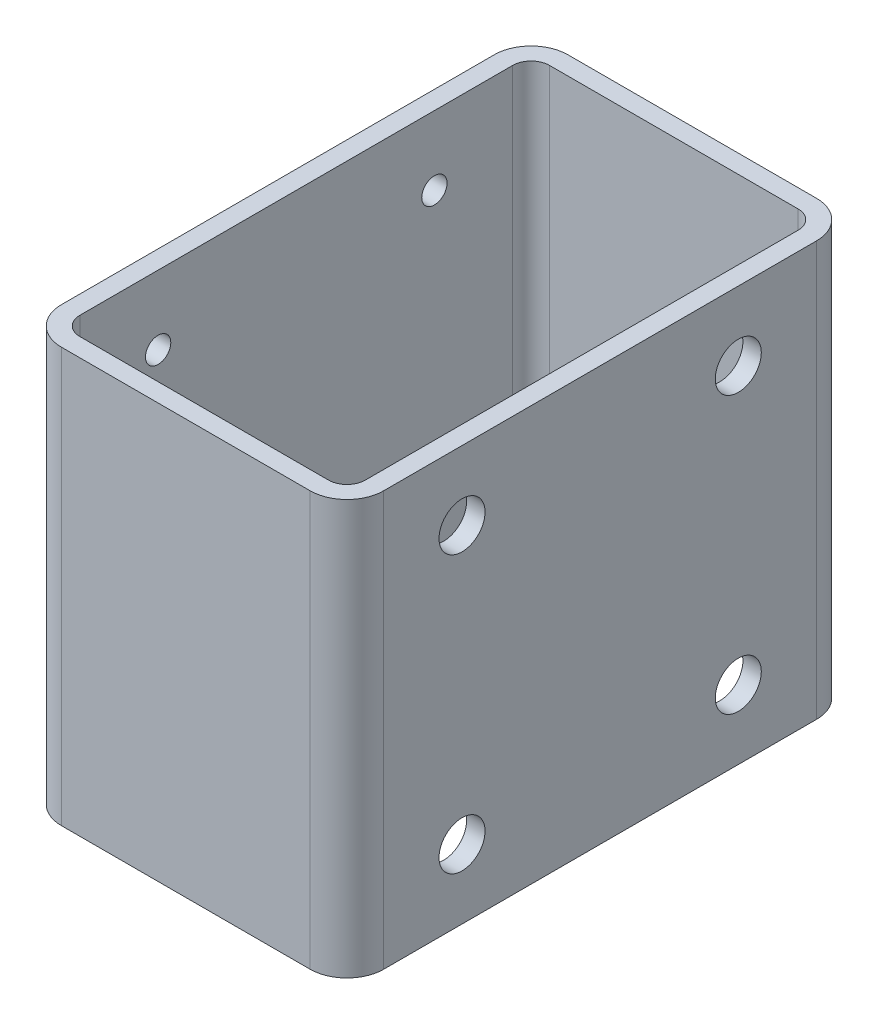
ISO-10303-21;
HEADER;
FILE_DESCRIPTION(('STEP AP214'),'2;1');
FILE_NAME('part.step','',(''),(''),'','','');
FILE_SCHEMA(('AUTOMOTIVE_DESIGN { 1 0 10303 214 1 1 1 1 }'));
ENDSEC;
DATA;
#1=APPLICATION_CONTEXT('core data for automotive mechanical design processes');
#2=APPLICATION_PROTOCOL_DEFINITION('international standard','automotive_design',2000,#1);
#3=PRODUCT_CONTEXT('',#1,'mechanical');
#4=PRODUCT('Part','Part','',(#3));
#5=PRODUCT_RELATED_PRODUCT_CATEGORY('part','',(#4));
#6=PRODUCT_DEFINITION_FORMATION('','',#4);
#7=PRODUCT_DEFINITION_CONTEXT('part definition',#1,'design');
#8=PRODUCT_DEFINITION('design','',#6,#7);
#9=PRODUCT_DEFINITION_SHAPE('','',#8);
#10=(LENGTH_UNIT() NAMED_UNIT(*) SI_UNIT(.MILLI.,.METRE.));
#11=(NAMED_UNIT(*) PLANE_ANGLE_UNIT() SI_UNIT($,.RADIAN.));
#12=(NAMED_UNIT(*) SI_UNIT($,.STERADIAN.) SOLID_ANGLE_UNIT());
#13=UNCERTAINTY_MEASURE_WITH_UNIT(LENGTH_MEASURE(1.E-05),#10,'distance_accuracy_value','');
#14=(GEOMETRIC_REPRESENTATION_CONTEXT(3) GLOBAL_UNCERTAINTY_ASSIGNED_CONTEXT((#13)) GLOBAL_UNIT_ASSIGNED_CONTEXT((#10,
#11,#12)) REPRESENTATION_CONTEXT('',''));
#15=CARTESIAN_POINT('',(0.,0.,0.));
#16=DIRECTION('',(0.,0.,1.));
#17=DIRECTION('',(1.,0.,0.));
#18=AXIS2_PLACEMENT_3D('',#15,#16,#17);
#19=CARTESIAN_POINT('',(-54.,180.,94.));
#20=DIRECTION('',(0.,-1.,0.));
#21=DIRECTION('',(0.,0.,-1.));
#22=AXIS2_PLACEMENT_3D('',#19,#20,#21);
#23=CYLINDRICAL_SURFACE('',#22,16.);
#24=CARTESIAN_POINT('',(-54.,0.,94.));
#25=DIRECTION('',(0.,1.,0.));
#26=DIRECTION('',(0.,0.,1.));
#27=AXIS2_PLACEMENT_3D('',#24,#25,#26);
#28=CIRCLE('',#27,16.);
#29=CARTESIAN_POINT('',(-70.0000000000001,0.,94.));
#30=VERTEX_POINT('',#29);
#31=CARTESIAN_POINT('',(-54.,0.,110.));
#32=VERTEX_POINT('',#31);
#33=EDGE_CURVE('E238',#30,#32,#28,.T.);
#34=ORIENTED_EDGE('',*,*,#33,.T.);
#35=DIRECTION('',(0.,-1.,0.));
#36=VECTOR('',#35,1.);
#37=CARTESIAN_POINT('',(-54.,180.,110.));
#38=LINE('',#37,#36);
#39=CARTESIAN_POINT('',(-54.,180.,110.));
#40=VERTEX_POINT('',#39);
#41=EDGE_CURVE('E12',#40,#32,#38,.T.);
#42=ORIENTED_EDGE('',*,*,#41,.F.);
#43=CARTESIAN_POINT('',(-54.,180.,94.));
#44=DIRECTION('',(0.,1.,0.));
#45=DIRECTION('',(0.,0.,1.));
#46=AXIS2_PLACEMENT_3D('',#43,#44,#45);
#47=CIRCLE('',#46,16.);
#48=CARTESIAN_POINT('',(-70.0000000000001,180.,94.));
#49=VERTEX_POINT('',#48);
#50=EDGE_CURVE('E342',#49,#40,#47,.T.);
#51=ORIENTED_EDGE('',*,*,#50,.F.);
#52=DIRECTION('',(0.,-1.,0.));
#53=VECTOR('',#52,1.);
#54=CARTESIAN_POINT('',(-70.0000000000001,180.,94.));
#55=LINE('',#54,#53);
#56=EDGE_CURVE('E253',#49,#30,#55,.T.);
#57=ORIENTED_EDGE('',*,*,#56,.T.);
#58=EDGE_LOOP('',(#34,#42,#51,#57));
#59=FACE_BOUND('',#58,.T.);
#60=ADVANCED_FACE('F64',(#59),#23,.T.);
#61=CARTESIAN_POINT('',(-54.,180.,110.));
#62=DIRECTION('',(0.,0.,-1.));
#63=DIRECTION('',(-1.,0.,0.));
#64=AXIS2_PLACEMENT_3D('',#61,#62,#63);
#65=PLANE('',#64);
#66=DIRECTION('',(1.,0.,0.));
#67=VECTOR('',#66,1.);
#68=CARTESIAN_POINT('',(-54.,0.,110.));
#69=LINE('',#68,#67);
#70=CARTESIAN_POINT('',(54.0000000000001,0.,110.));
#71=VERTEX_POINT('',#70);
#72=EDGE_CURVE('E241',#32,#71,#69,.T.);
#73=ORIENTED_EDGE('',*,*,#72,.T.);
#74=DIRECTION('',(0.,-1.,0.));
#75=VECTOR('',#74,1.);
#76=CARTESIAN_POINT('',(54.0000000000001,180.,110.));
#77=LINE('',#76,#75);
#78=CARTESIAN_POINT('',(54.0000000000001,180.,110.));
#79=VERTEX_POINT('',#78);
#80=EDGE_CURVE('E74',#79,#71,#77,.T.);
#81=ORIENTED_EDGE('',*,*,#80,.F.);
#82=DIRECTION('',(1.,0.,0.));
#83=VECTOR('',#82,1.);
#84=CARTESIAN_POINT('',(-54.,180.,110.));
#85=LINE('',#84,#83);
#86=EDGE_CURVE('E344',#40,#79,#85,.T.);
#87=ORIENTED_EDGE('',*,*,#86,.F.);
#88=ORIENTED_EDGE('',*,*,#41,.T.);
#89=EDGE_LOOP('',(#73,#81,#87,#88));
#90=FACE_BOUND('',#89,.T.);
#91=ADVANCED_FACE('F385',(#90),#65,.F.);
#92=CARTESIAN_POINT('',(54.0000000000001,180.,94.));
#93=DIRECTION('',(0.,-1.,0.));
#94=DIRECTION('',(0.,0.,-1.));
#95=AXIS2_PLACEMENT_3D('',#92,#93,#94);
#96=CYLINDRICAL_SURFACE('',#95,16.);
#97=CARTESIAN_POINT('',(54.0000000000001,0.,94.));
#98=DIRECTION('',(0.,1.,0.));
#99=DIRECTION('',(0.,0.,1.));
#100=AXIS2_PLACEMENT_3D('',#97,#98,#99);
#101=CIRCLE('',#100,16.);
#102=CARTESIAN_POINT('',(70.0000000000001,0.,94.));
#103=VERTEX_POINT('',#102);
#104=EDGE_CURVE('E243',#71,#103,#101,.T.);
#105=ORIENTED_EDGE('',*,*,#104,.T.);
#106=DIRECTION('',(0.,-1.,0.));
#107=VECTOR('',#106,1.);
#108=CARTESIAN_POINT('',(70.0000000000001,180.,94.));
#109=LINE('',#108,#107);
#110=CARTESIAN_POINT('',(70.0000000000001,180.,94.));
#111=VERTEX_POINT('',#110);
#112=EDGE_CURVE('E260',#111,#103,#109,.T.);
#113=ORIENTED_EDGE('',*,*,#112,.F.);
#114=CARTESIAN_POINT('',(54.0000000000001,180.,94.));
#115=DIRECTION('',(0.,1.,0.));
#116=DIRECTION('',(0.,0.,1.));
#117=AXIS2_PLACEMENT_3D('',#114,#115,#116);
#118=CIRCLE('',#117,16.);
#119=EDGE_CURVE('E346',#79,#111,#118,.T.);
#120=ORIENTED_EDGE('',*,*,#119,.F.);
#121=ORIENTED_EDGE('',*,*,#80,.T.);
#122=EDGE_LOOP('',(#105,#113,#120,#121));
#123=FACE_BOUND('',#122,.T.);
#124=ADVANCED_FACE('F390',(#123),#96,.T.);
#125=CARTESIAN_POINT('',(70.,180.,-94.));
#126=DIRECTION('',(-1.,0.,0.));
#127=DIRECTION('',(0.,0.,1.));
#128=AXIS2_PLACEMENT_3D('',#125,#126,#127);
#129=PLANE('',#128);
#130=CARTESIAN_POINT('',(70.,150.,-60.));
#131=DIRECTION('',(1.,0.,0.));
#132=DIRECTION('',(0.,0.,-1.));
#133=AXIS2_PLACEMENT_3D('',#130,#131,#132);
#134=CIRCLE('',#133,10.);
#135=CARTESIAN_POINT('',(70.,150.,-70.));
#136=VERTEX_POINT('',#135);
#137=EDGE_CURVE('E480',#136,#136,#134,.T.);
#138=ORIENTED_EDGE('',*,*,#137,.F.);
#139=EDGE_LOOP('',(#138));
#140=FACE_BOUND('',#139,.T.);
#141=CARTESIAN_POINT('',(70.0000000000001,30.,60.));
#142=DIRECTION('',(1.,0.,0.));
#143=DIRECTION('',(0.,0.,-1.));
#144=AXIS2_PLACEMENT_3D('',#141,#142,#143);
#145=CIRCLE('',#144,10.);
#146=CARTESIAN_POINT('',(70.0000000000001,30.,50.));
#147=VERTEX_POINT('',#146);
#148=EDGE_CURVE('E477',#147,#147,#145,.T.);
#149=ORIENTED_EDGE('',*,*,#148,.F.);
#150=EDGE_LOOP('',(#149));
#151=FACE_BOUND('',#150,.T.);
#152=CARTESIAN_POINT('',(70.,30.,-60.));
#153=DIRECTION('',(1.,0.,0.));
#154=DIRECTION('',(0.,0.,-1.));
#155=AXIS2_PLACEMENT_3D('',#152,#153,#154);
#156=CIRCLE('',#155,10.);
#157=CARTESIAN_POINT('',(70.,30.,-70.));
#158=VERTEX_POINT('',#157);
#159=EDGE_CURVE('E475',#158,#158,#156,.T.);
#160=ORIENTED_EDGE('',*,*,#159,.F.);
#161=EDGE_LOOP('',(#160));
#162=FACE_BOUND('',#161,.T.);
#163=CARTESIAN_POINT('',(70.0000000000001,150.,60.));
#164=DIRECTION('',(1.,0.,0.));
#165=DIRECTION('',(0.,0.,-1.));
#166=AXIS2_PLACEMENT_3D('',#163,#164,#165);
#167=CIRCLE('',#166,10.);
#168=CARTESIAN_POINT('',(70.0000000000001,150.,50.));
#169=VERTEX_POINT('',#168);
#170=EDGE_CURVE('E283',#169,#169,#167,.T.);
#171=ORIENTED_EDGE('',*,*,#170,.F.);
#172=EDGE_LOOP('',(#171));
#173=FACE_BOUND('',#172,.T.);
#174=DIRECTION('',(0.,0.,-1.));
#175=VECTOR('',#174,1.);
#176=CARTESIAN_POINT('',(70.,0.,-94.));
#177=LINE('',#176,#175);
#178=CARTESIAN_POINT('',(70.,0.,-94.));
#179=VERTEX_POINT('',#178);
#180=EDGE_CURVE('E245',#103,#179,#177,.T.);
#181=ORIENTED_EDGE('',*,*,#180,.T.);
#182=DIRECTION('',(0.,-1.,0.));
#183=VECTOR('',#182,1.);
#184=CARTESIAN_POINT('',(70.,180.,-94.));
#185=LINE('',#184,#183);
#186=CARTESIAN_POINT('',(70.,180.,-94.));
#187=VERTEX_POINT('',#186);
#188=EDGE_CURVE('E257',#187,#179,#185,.T.);
#189=ORIENTED_EDGE('',*,*,#188,.F.);
#190=DIRECTION('',(0.,0.,-1.));
#191=VECTOR('',#190,1.);
#192=CARTESIAN_POINT('',(70.,180.,-94.));
#193=LINE('',#192,#191);
#194=EDGE_CURVE('E348',#111,#187,#193,.T.);
#195=ORIENTED_EDGE('',*,*,#194,.F.);
#196=ORIENTED_EDGE('',*,*,#112,.T.);
#197=EDGE_LOOP('',(#181,#189,#195,#196));
#198=FACE_BOUND('',#197,.T.);
#199=ADVANCED_FACE('F354',(#140,#151,#162,#173,#198),#129,.F.);
#200=CARTESIAN_POINT('',(54.,180.,-94.));
#201=DIRECTION('',(0.,-1.,0.));
#202=DIRECTION('',(0.,0.,-1.));
#203=AXIS2_PLACEMENT_3D('',#200,#201,#202);
#204=CYLINDRICAL_SURFACE('',#203,16.);
#205=CARTESIAN_POINT('',(54.,0.,-94.));
#206=DIRECTION('',(0.,1.,0.));
#207=DIRECTION('',(0.,0.,1.));
#208=AXIS2_PLACEMENT_3D('',#205,#206,#207);
#209=CIRCLE('',#208,16.);
#210=CARTESIAN_POINT('',(54.0000000000001,0.,-110.));
#211=VERTEX_POINT('',#210);
#212=EDGE_CURVE('E247',#179,#211,#209,.T.);
#213=ORIENTED_EDGE('',*,*,#212,.T.);
#214=DIRECTION('',(0.,-1.,0.));
#215=VECTOR('',#214,1.);
#216=CARTESIAN_POINT('',(54.0000000000001,180.,-110.));
#217=LINE('',#216,#215);
#218=CARTESIAN_POINT('',(54.0000000000001,180.,-110.));
#219=VERTEX_POINT('',#218);
#220=EDGE_CURVE('E204',#219,#211,#217,.T.);
#221=ORIENTED_EDGE('',*,*,#220,.F.);
#222=CARTESIAN_POINT('',(54.,180.,-94.));
#223=DIRECTION('',(0.,1.,0.));
#224=DIRECTION('',(0.,0.,1.));
#225=AXIS2_PLACEMENT_3D('',#222,#223,#224);
#226=CIRCLE('',#225,16.);
#227=EDGE_CURVE('E195',#187,#219,#226,.T.);
#228=ORIENTED_EDGE('',*,*,#227,.F.);
#229=ORIENTED_EDGE('',*,*,#188,.T.);
#230=EDGE_LOOP('',(#213,#221,#228,#229));
#231=FACE_BOUND('',#230,.T.);
#232=ADVANCED_FACE('F358',(#231),#204,.T.);
#233=CARTESIAN_POINT('',(54.0000000000001,180.,-110.));
#234=DIRECTION('',(0.,0.,1.));
#235=DIRECTION('',(1.,0.,0.));
#236=AXIS2_PLACEMENT_3D('',#233,#234,#235);
#237=PLANE('',#236);
#238=DIRECTION('',(-1.,0.,0.));
#239=VECTOR('',#238,1.);
#240=CARTESIAN_POINT('',(54.0000000000001,0.,-110.));
#241=LINE('',#240,#239);
#242=CARTESIAN_POINT('',(-54.,0.,-110.));
#243=VERTEX_POINT('',#242);
#244=EDGE_CURVE('E203',#211,#243,#241,.T.);
#245=ORIENTED_EDGE('',*,*,#244,.T.);
#246=DIRECTION('',(0.,-1.,0.));
#247=VECTOR('',#246,1.);
#248=CARTESIAN_POINT('',(-54.,180.,-110.));
#249=LINE('',#248,#247);
#250=CARTESIAN_POINT('',(-54.,180.,-110.));
#251=VERTEX_POINT('',#250);
#252=EDGE_CURVE('E200',#251,#243,#249,.T.);
#253=ORIENTED_EDGE('',*,*,#252,.F.);
#254=DIRECTION('',(-1.,0.,0.));
#255=VECTOR('',#254,1.);
#256=CARTESIAN_POINT('',(54.0000000000001,180.,-110.));
#257=LINE('',#256,#255);
#258=EDGE_CURVE('E189',#219,#251,#257,.T.);
#259=ORIENTED_EDGE('',*,*,#258,.F.);
#260=ORIENTED_EDGE('',*,*,#220,.T.);
#261=EDGE_LOOP('',(#245,#253,#259,#260));
#262=FACE_BOUND('',#261,.T.);
#263=ADVANCED_FACE('F201',(#262),#237,.F.);
#264=CARTESIAN_POINT('',(-54.,180.,-94.));
#265=DIRECTION('',(0.,-1.,0.));
#266=DIRECTION('',(0.,0.,-1.));
#267=AXIS2_PLACEMENT_3D('',#264,#265,#266);
#268=CYLINDRICAL_SURFACE('',#267,16.);
#269=CARTESIAN_POINT('',(-54.,0.,-94.));
#270=DIRECTION('',(0.,1.,0.));
#271=DIRECTION('',(0.,0.,1.));
#272=AXIS2_PLACEMENT_3D('',#269,#270,#271);
#273=CIRCLE('',#272,16.);
#274=CARTESIAN_POINT('',(-70.0000000000001,0.,-94.));
#275=VERTEX_POINT('',#274);
#276=EDGE_CURVE('E136',#243,#275,#273,.T.);
#277=ORIENTED_EDGE('',*,*,#276,.T.);
#278=DIRECTION('',(0.,-1.,0.));
#279=VECTOR('',#278,1.);
#280=CARTESIAN_POINT('',(-70.0000000000001,180.,-94.));
#281=LINE('',#280,#279);
#282=CARTESIAN_POINT('',(-70.0000000000001,180.,-94.));
#283=VERTEX_POINT('',#282);
#284=EDGE_CURVE('E205',#283,#275,#281,.T.);
#285=ORIENTED_EDGE('',*,*,#284,.F.);
#286=CARTESIAN_POINT('',(-54.,180.,-94.));
#287=DIRECTION('',(0.,1.,0.));
#288=DIRECTION('',(0.,0.,1.));
#289=AXIS2_PLACEMENT_3D('',#286,#287,#288);
#290=CIRCLE('',#289,16.);
#291=EDGE_CURVE('E193',#251,#283,#290,.T.);
#292=ORIENTED_EDGE('',*,*,#291,.F.);
#293=ORIENTED_EDGE('',*,*,#252,.T.);
#294=EDGE_LOOP('',(#277,#285,#292,#293));
#295=FACE_BOUND('',#294,.T.);
#296=ADVANCED_FACE('F207',(#295),#268,.T.);
#297=CARTESIAN_POINT('',(54.0000000000001,180.,94.));
#298=DIRECTION('',(0.,-1.,0.));
#299=DIRECTION('',(0.,0.,-1.));
#300=AXIS2_PLACEMENT_3D('',#297,#298,#299);
#301=CYLINDRICAL_SURFACE('',#300,8.00000000000003);
#302=CARTESIAN_POINT('',(54.0000000000001,0.,94.));
#303=DIRECTION('',(0.,1.,0.));
#304=DIRECTION('',(0.,0.,1.));
#305=AXIS2_PLACEMENT_3D('',#302,#303,#304);
#306=CIRCLE('',#305,8.00000000000003);
#307=CARTESIAN_POINT('',(54.,0.,102.));
#308=VERTEX_POINT('',#307);
#309=CARTESIAN_POINT('',(62.0000000000001,0.,94.));
#310=VERTEX_POINT('',#309);
#311=EDGE_CURVE('E213',#308,#310,#306,.T.);
#312=ORIENTED_EDGE('',*,*,#311,.F.);
#313=DIRECTION('',(0.,-1.,0.));
#314=VECTOR('',#313,1.);
#315=CARTESIAN_POINT('',(54.,180.,102.));
#316=LINE('',#315,#314);
#317=CARTESIAN_POINT('',(54.,180.,102.));
#318=VERTEX_POINT('',#317);
#319=EDGE_CURVE('E150',#318,#308,#316,.T.);
#320=ORIENTED_EDGE('',*,*,#319,.F.);
#321=CARTESIAN_POINT('',(54.0000000000001,180.,94.));
#322=DIRECTION('',(0.,1.,0.));
#323=DIRECTION('',(0.,0.,1.));
#324=AXIS2_PLACEMENT_3D('',#321,#322,#323);
#325=CIRCLE('',#324,8.00000000000003);
#326=CARTESIAN_POINT('',(62.0000000000001,180.,94.));
#327=VERTEX_POINT('',#326);
#328=EDGE_CURVE('E252',#318,#327,#325,.T.);
#329=ORIENTED_EDGE('',*,*,#328,.T.);
#330=DIRECTION('',(0.,-1.,0.));
#331=VECTOR('',#330,1.);
#332=CARTESIAN_POINT('',(62.0000000000001,180.,94.));
#333=LINE('',#332,#331);
#334=EDGE_CURVE('E209',#327,#310,#333,.T.);
#335=ORIENTED_EDGE('',*,*,#334,.T.);
#336=EDGE_LOOP('',(#312,#320,#329,#335));
#337=FACE_BOUND('',#336,.T.);
#338=ADVANCED_FACE('F66',(#337),#301,.F.);
#339=CARTESIAN_POINT('',(-54.,180.,102.));
#340=DIRECTION('',(0.,0.,-1.));
#341=DIRECTION('',(-1.,0.,0.));
#342=AXIS2_PLACEMENT_3D('',#339,#340,#341);
#343=PLANE('',#342);
#344=DIRECTION('',(1.,0.,0.));
#345=VECTOR('',#344,1.);
#346=CARTESIAN_POINT('',(-54.,0.,102.));
#347=LINE('',#346,#345);
#348=CARTESIAN_POINT('',(-54.,0.,102.));
#349=VERTEX_POINT('',#348);
#350=EDGE_CURVE('E216',#349,#308,#347,.T.);
#351=ORIENTED_EDGE('',*,*,#350,.F.);
#352=DIRECTION('',(0.,-1.,0.));
#353=VECTOR('',#352,1.);
#354=CARTESIAN_POINT('',(-54.,180.,102.));
#355=LINE('',#354,#353);
#356=CARTESIAN_POINT('',(-54.,180.,102.));
#357=VERTEX_POINT('',#356);
#358=EDGE_CURVE('E276',#357,#349,#355,.T.);
#359=ORIENTED_EDGE('',*,*,#358,.F.);
#360=DIRECTION('',(1.,0.,0.));
#361=VECTOR('',#360,1.);
#362=CARTESIAN_POINT('',(-54.,180.,102.));
#363=LINE('',#362,#361);
#364=EDGE_CURVE('E321',#357,#318,#363,.T.);
#365=ORIENTED_EDGE('',*,*,#364,.T.);
#366=ORIENTED_EDGE('',*,*,#319,.T.);
#367=EDGE_LOOP('',(#351,#359,#365,#366));
#368=FACE_BOUND('',#367,.T.);
#369=ADVANCED_FACE('F412',(#368),#343,.T.);
#370=CARTESIAN_POINT('',(-54.,180.,94.));
#371=DIRECTION('',(0.,-1.,0.));
#372=DIRECTION('',(0.,0.,-1.));
#373=AXIS2_PLACEMENT_3D('',#370,#371,#372);
#374=CYLINDRICAL_SURFACE('',#373,8.00000000000002);
#375=CARTESIAN_POINT('',(-54.,0.,94.));
#376=DIRECTION('',(0.,1.,0.));
#377=DIRECTION('',(0.,0.,1.));
#378=AXIS2_PLACEMENT_3D('',#375,#376,#377);
#379=CIRCLE('',#378,8.00000000000002);
#380=CARTESIAN_POINT('',(-62.0000000000001,0.,94.));
#381=VERTEX_POINT('',#380);
#382=EDGE_CURVE('E220',#381,#349,#379,.T.);
#383=ORIENTED_EDGE('',*,*,#382,.F.);
#384=DIRECTION('',(0.,-1.,0.));
#385=VECTOR('',#384,1.);
#386=CARTESIAN_POINT('',(-62.0000000000001,180.,94.));
#387=LINE('',#386,#385);
#388=CARTESIAN_POINT('',(-62.0000000000001,180.,94.));
#389=VERTEX_POINT('',#388);
#390=EDGE_CURVE('E274',#389,#381,#387,.T.);
#391=ORIENTED_EDGE('',*,*,#390,.F.);
#392=CARTESIAN_POINT('',(-54.,180.,94.));
#393=DIRECTION('',(0.,1.,0.));
#394=DIRECTION('',(0.,0.,1.));
#395=AXIS2_PLACEMENT_3D('',#392,#393,#394);
#396=CIRCLE('',#395,8.00000000000002);
#397=EDGE_CURVE('E324',#389,#357,#396,.T.);
#398=ORIENTED_EDGE('',*,*,#397,.T.);
#399=ORIENTED_EDGE('',*,*,#358,.T.);
#400=EDGE_LOOP('',(#383,#391,#398,#399));
#401=FACE_BOUND('',#400,.T.);
#402=ADVANCED_FACE('F409',(#401),#374,.F.);
#403=CARTESIAN_POINT('',(-62.0000000000001,180.,94.));
#404=DIRECTION('',(1.,0.,0.));
#405=DIRECTION('',(0.,0.,-1.));
#406=AXIS2_PLACEMENT_3D('',#403,#404,#405);
#407=PLANE('',#406);
#408=CARTESIAN_POINT('',(-62.0000000000001,30.,60.));
#409=DIRECTION('',(1.,0.,0.));
#410=DIRECTION('',(0.,0.,-1.));
#411=AXIS2_PLACEMENT_3D('',#408,#409,#410);
#412=CIRCLE('',#411,5.5);
#413=CARTESIAN_POINT('',(-62.0000000000001,30.,54.5));
#414=VERTEX_POINT('',#413);
#415=EDGE_CURVE('E217',#414,#414,#412,.T.);
#416=ORIENTED_EDGE('',*,*,#415,.F.);
#417=EDGE_LOOP('',(#416));
#418=FACE_BOUND('',#417,.T.);
#419=CARTESIAN_POINT('',(-62.0000000000001,150.,-60.));
#420=DIRECTION('',(1.,0.,0.));
#421=DIRECTION('',(0.,0.,-1.));
#422=AXIS2_PLACEMENT_3D('',#419,#420,#421);
#423=CIRCLE('',#422,5.5);
#424=CARTESIAN_POINT('',(-62.0000000000001,150.,-65.5));
#425=VERTEX_POINT('',#424);
#426=EDGE_CURVE('E315',#425,#425,#423,.T.);
#427=ORIENTED_EDGE('',*,*,#426,.F.);
#428=EDGE_LOOP('',(#427));
#429=FACE_BOUND('',#428,.T.);
#430=CARTESIAN_POINT('',(-62.0000000000001,150.,60.));
#431=DIRECTION('',(1.,0.,0.));
#432=DIRECTION('',(0.,0.,-1.));
#433=AXIS2_PLACEMENT_3D('',#430,#431,#432);
#434=CIRCLE('',#433,5.5);
#435=CARTESIAN_POINT('',(-62.0000000000001,150.,54.5));
#436=VERTEX_POINT('',#435);
#437=EDGE_CURVE('E312',#436,#436,#434,.T.);
#438=ORIENTED_EDGE('',*,*,#437,.F.);
#439=EDGE_LOOP('',(#438));
#440=FACE_BOUND('',#439,.T.);
#441=CARTESIAN_POINT('',(-62.0000000000001,30.,-60.));
#442=DIRECTION('',(1.,0.,0.));
#443=DIRECTION('',(0.,0.,-1.));
#444=AXIS2_PLACEMENT_3D('',#441,#442,#443);
#445=CIRCLE('',#444,5.5);
#446=CARTESIAN_POINT('',(-62.0000000000001,30.,-65.5));
#447=VERTEX_POINT('',#446);
#448=EDGE_CURVE('E309',#447,#447,#445,.T.);
#449=ORIENTED_EDGE('',*,*,#448,.F.);
#450=EDGE_LOOP('',(#449));
#451=FACE_BOUND('',#450,.T.);
#452=DIRECTION('',(0.,0.,1.));
#453=VECTOR('',#452,1.);
#454=CARTESIAN_POINT('',(-62.0000000000001,0.,94.));
#455=LINE('',#454,#453);
#456=CARTESIAN_POINT('',(-62.0000000000001,0.,-94.));
#457=VERTEX_POINT('',#456);
#458=EDGE_CURVE('E223',#457,#381,#455,.T.);
#459=ORIENTED_EDGE('',*,*,#458,.F.);
#460=DIRECTION('',(0.,-1.,0.));
#461=VECTOR('',#460,1.);
#462=CARTESIAN_POINT('',(-62.0000000000001,180.,-94.));
#463=LINE('',#462,#461);
#464=CARTESIAN_POINT('',(-62.0000000000001,180.,-94.));
#465=VERTEX_POINT('',#464);
#466=EDGE_CURVE('E272',#465,#457,#463,.T.);
#467=ORIENTED_EDGE('',*,*,#466,.F.);
#468=DIRECTION('',(0.,0.,1.));
#469=VECTOR('',#468,1.);
#470=CARTESIAN_POINT('',(-62.0000000000001,180.,94.));
#471=LINE('',#470,#469);
#472=EDGE_CURVE('E327',#465,#389,#471,.T.);
#473=ORIENTED_EDGE('',*,*,#472,.T.);
#474=ORIENTED_EDGE('',*,*,#390,.T.);
#475=EDGE_LOOP('',(#459,#467,#473,#474));
#476=FACE_BOUND('',#475,.T.);
#477=ADVANCED_FACE('F405',(#418,#429,#440,#451,#476),#407,.T.);
#478=CARTESIAN_POINT('',(-54.,180.,-94.));
#479=DIRECTION('',(0.,-1.,0.));
#480=DIRECTION('',(0.,0.,-1.));
#481=AXIS2_PLACEMENT_3D('',#478,#479,#480);
#482=CYLINDRICAL_SURFACE('',#481,8.00000000000002);
#483=CARTESIAN_POINT('',(-54.,0.,-94.));
#484=DIRECTION('',(0.,1.,0.));
#485=DIRECTION('',(0.,0.,1.));
#486=AXIS2_PLACEMENT_3D('',#483,#484,#485);
#487=CIRCLE('',#486,8.00000000000002);
#488=CARTESIAN_POINT('',(-54.,0.,-102.));
#489=VERTEX_POINT('',#488);
#490=EDGE_CURVE('E226',#489,#457,#487,.T.);
#491=ORIENTED_EDGE('',*,*,#490,.F.);
#492=DIRECTION('',(0.,-1.,0.));
#493=VECTOR('',#492,1.);
#494=CARTESIAN_POINT('',(-54.,180.,-102.));
#495=LINE('',#494,#493);
#496=CARTESIAN_POINT('',(-54.,180.,-102.));
#497=VERTEX_POINT('',#496);
#498=EDGE_CURVE('E270',#497,#489,#495,.T.);
#499=ORIENTED_EDGE('',*,*,#498,.F.);
#500=CARTESIAN_POINT('',(-54.,180.,-94.));
#501=DIRECTION('',(0.,1.,0.));
#502=DIRECTION('',(0.,0.,1.));
#503=AXIS2_PLACEMENT_3D('',#500,#501,#502);
#504=CIRCLE('',#503,8.00000000000002);
#505=EDGE_CURVE('E330',#497,#465,#504,.T.);
#506=ORIENTED_EDGE('',*,*,#505,.T.);
#507=ORIENTED_EDGE('',*,*,#466,.T.);
#508=EDGE_LOOP('',(#491,#499,#506,#507));
#509=FACE_BOUND('',#508,.T.);
#510=ADVANCED_FACE('F401',(#509),#482,.F.);
#511=CARTESIAN_POINT('',(54.,180.,-102.));
#512=DIRECTION('',(0.,0.,1.));
#513=DIRECTION('',(1.,0.,0.));
#514=AXIS2_PLACEMENT_3D('',#511,#512,#513);
#515=PLANE('',#514);
#516=DIRECTION('',(-1.,0.,0.));
#517=VECTOR('',#516,1.);
#518=CARTESIAN_POINT('',(54.,0.,-102.));
#519=LINE('',#518,#517);
#520=CARTESIAN_POINT('',(54.,0.,-102.));
#521=VERTEX_POINT('',#520);
#522=EDGE_CURVE('E229',#521,#489,#519,.T.);
#523=ORIENTED_EDGE('',*,*,#522,.F.);
#524=DIRECTION('',(0.,-1.,0.));
#525=VECTOR('',#524,1.);
#526=CARTESIAN_POINT('',(54.,180.,-102.));
#527=LINE('',#526,#525);
#528=CARTESIAN_POINT('',(54.,180.,-102.));
#529=VERTEX_POINT('',#528);
#530=EDGE_CURVE('E268',#529,#521,#527,.T.);
#531=ORIENTED_EDGE('',*,*,#530,.F.);
#532=DIRECTION('',(-1.,0.,0.));
#533=VECTOR('',#532,1.);
#534=CARTESIAN_POINT('',(54.,180.,-102.));
#535=LINE('',#534,#533);
#536=EDGE_CURVE('E333',#529,#497,#535,.T.);
#537=ORIENTED_EDGE('',*,*,#536,.T.);
#538=ORIENTED_EDGE('',*,*,#498,.T.);
#539=EDGE_LOOP('',(#523,#531,#537,#538));
#540=FACE_BOUND('',#539,.T.);
#541=ADVANCED_FACE('F397',(#540),#515,.T.);
#542=CARTESIAN_POINT('',(54.,180.,-94.));
#543=DIRECTION('',(0.,-1.,0.));
#544=DIRECTION('',(0.,0.,-1.));
#545=AXIS2_PLACEMENT_3D('',#542,#543,#544);
#546=CYLINDRICAL_SURFACE('',#545,8.00000000000001);
#547=CARTESIAN_POINT('',(54.,0.,-94.));
#548=DIRECTION('',(0.,1.,0.));
#549=DIRECTION('',(0.,0.,1.));
#550=AXIS2_PLACEMENT_3D('',#547,#548,#549);
#551=CIRCLE('',#550,8.00000000000001);
#552=CARTESIAN_POINT('',(62.,0.,-94.));
#553=VERTEX_POINT('',#552);
#554=EDGE_CURVE('E232',#553,#521,#551,.T.);
#555=ORIENTED_EDGE('',*,*,#554,.F.);
#556=DIRECTION('',(0.,-1.,0.));
#557=VECTOR('',#556,1.);
#558=CARTESIAN_POINT('',(62.,180.,-94.));
#559=LINE('',#558,#557);
#560=CARTESIAN_POINT('',(62.,180.,-94.));
#561=VERTEX_POINT('',#560);
#562=EDGE_CURVE('E266',#561,#553,#559,.T.);
#563=ORIENTED_EDGE('',*,*,#562,.F.);
#564=CARTESIAN_POINT('',(54.,180.,-94.));
#565=DIRECTION('',(0.,1.,0.));
#566=DIRECTION('',(0.,0.,1.));
#567=AXIS2_PLACEMENT_3D('',#564,#565,#566);
#568=CIRCLE('',#567,8.00000000000001);
#569=EDGE_CURVE('E336',#561,#529,#568,.T.);
#570=ORIENTED_EDGE('',*,*,#569,.T.);
#571=ORIENTED_EDGE('',*,*,#530,.T.);
#572=EDGE_LOOP('',(#555,#563,#570,#571));
#573=FACE_BOUND('',#572,.T.);
#574=ADVANCED_FACE('F377',(#573),#546,.F.);
#575=CARTESIAN_POINT('',(62.,180.,-94.));
#576=DIRECTION('',(-1.,0.,0.));
#577=DIRECTION('',(0.,0.,1.));
#578=AXIS2_PLACEMENT_3D('',#575,#576,#577);
#579=PLANE('',#578);
#580=CARTESIAN_POINT('',(62.,150.,-60.));
#581=DIRECTION('',(-1.,0.,0.));
#582=DIRECTION('',(0.,0.,1.));
#583=AXIS2_PLACEMENT_3D('',#580,#581,#582);
#584=CIRCLE('',#583,10.);
#585=CARTESIAN_POINT('',(62.,150.,-50.));
#586=VERTEX_POINT('',#585);
#587=EDGE_CURVE('E68',#586,#586,#584,.T.);
#588=ORIENTED_EDGE('',*,*,#587,.F.);
#589=EDGE_LOOP('',(#588));
#590=FACE_BOUND('',#589,.T.);
#591=CARTESIAN_POINT('',(62.0000000000001,30.,60.));
#592=DIRECTION('',(-1.,0.,0.));
#593=DIRECTION('',(0.,0.,1.));
#594=AXIS2_PLACEMENT_3D('',#591,#592,#593);
#595=CIRCLE('',#594,10.);
#596=CARTESIAN_POINT('',(62.0000000000001,30.,70.));
#597=VERTEX_POINT('',#596);
#598=EDGE_CURVE('E285',#597,#597,#595,.T.);
#599=ORIENTED_EDGE('',*,*,#598,.F.);
#600=EDGE_LOOP('',(#599));
#601=FACE_BOUND('',#600,.T.);
#602=CARTESIAN_POINT('',(62.,30.,-60.));
#603=DIRECTION('',(-1.,0.,0.));
#604=DIRECTION('',(0.,0.,1.));
#605=AXIS2_PLACEMENT_3D('',#602,#603,#604);
#606=CIRCLE('',#605,10.);
#607=CARTESIAN_POINT('',(62.,30.,-50.));
#608=VERTEX_POINT('',#607);
#609=EDGE_CURVE('E282',#608,#608,#606,.T.);
#610=ORIENTED_EDGE('',*,*,#609,.F.);
#611=EDGE_LOOP('',(#610));
#612=FACE_BOUND('',#611,.T.);
#613=CARTESIAN_POINT('',(62.0000000000001,150.,60.));
#614=DIRECTION('',(-1.,0.,0.));
#615=DIRECTION('',(0.,0.,1.));
#616=AXIS2_PLACEMENT_3D('',#613,#614,#615);
#617=CIRCLE('',#616,10.);
#618=CARTESIAN_POINT('',(62.0000000000001,150.,70.));
#619=VERTEX_POINT('',#618);
#620=EDGE_CURVE('E279',#619,#619,#617,.T.);
#621=ORIENTED_EDGE('',*,*,#620,.F.);
#622=EDGE_LOOP('',(#621));
#623=FACE_BOUND('',#622,.T.);
#624=DIRECTION('',(0.,0.,-1.));
#625=VECTOR('',#624,1.);
#626=CARTESIAN_POINT('',(62.,0.,-94.));
#627=LINE('',#626,#625);
#628=EDGE_CURVE('E235',#310,#553,#627,.T.);
#629=ORIENTED_EDGE('',*,*,#628,.F.);
#630=ORIENTED_EDGE('',*,*,#334,.F.);
#631=DIRECTION('',(0.,0.,-1.));
#632=VECTOR('',#631,1.);
#633=CARTESIAN_POINT('',(62.,180.,-94.));
#634=LINE('',#633,#632);
#635=EDGE_CURVE('E339',#327,#561,#634,.T.);
#636=ORIENTED_EDGE('',*,*,#635,.T.);
#637=ORIENTED_EDGE('',*,*,#562,.T.);
#638=EDGE_LOOP('',(#629,#630,#636,#637));
#639=FACE_BOUND('',#638,.T.);
#640=ADVANCED_FACE('F368',(#590,#601,#612,#623,#639),#579,.T.);
#641=CARTESIAN_POINT('',(-70.0000000000001,180.,94.));
#642=DIRECTION('',(1.,0.,0.));
#643=DIRECTION('',(0.,0.,-1.));
#644=AXIS2_PLACEMENT_3D('',#641,#642,#643);
#645=PLANE('',#644);
#646=CARTESIAN_POINT('',(-70.0000000000001,30.,60.));
#647=DIRECTION('',(-1.,0.,0.));
#648=DIRECTION('',(0.,0.,1.));
#649=AXIS2_PLACEMENT_3D('',#646,#647,#648);
#650=CIRCLE('',#649,5.5);
#651=CARTESIAN_POINT('',(-70.0000000000001,30.,65.5));
#652=VERTEX_POINT('',#651);
#653=EDGE_CURVE('E299',#652,#652,#650,.T.);
#654=ORIENTED_EDGE('',*,*,#653,.F.);
#655=EDGE_LOOP('',(#654));
#656=FACE_BOUND('',#655,.T.);
#657=CARTESIAN_POINT('',(-70.0000000000001,150.,-60.));
#658=DIRECTION('',(-1.,0.,0.));
#659=DIRECTION('',(0.,0.,1.));
#660=AXIS2_PLACEMENT_3D('',#657,#658,#659);
#661=CIRCLE('',#660,5.5);
#662=CARTESIAN_POINT('',(-70.0000000000001,150.,-54.5));
#663=VERTEX_POINT('',#662);
#664=EDGE_CURVE('E294',#663,#663,#661,.T.);
#665=ORIENTED_EDGE('',*,*,#664,.F.);
#666=EDGE_LOOP('',(#665));
#667=FACE_BOUND('',#666,.T.);
#668=CARTESIAN_POINT('',(-70.0000000000001,150.,60.));
#669=DIRECTION('',(-1.,0.,0.));
#670=DIRECTION('',(0.,0.,1.));
#671=AXIS2_PLACEMENT_3D('',#668,#669,#670);
#672=CIRCLE('',#671,5.5);
#673=CARTESIAN_POINT('',(-70.0000000000001,150.,65.5));
#674=VERTEX_POINT('',#673);
#675=EDGE_CURVE('E290',#674,#674,#672,.T.);
#676=ORIENTED_EDGE('',*,*,#675,.F.);
#677=EDGE_LOOP('',(#676));
#678=FACE_BOUND('',#677,.T.);
#679=CARTESIAN_POINT('',(-70.0000000000001,30.,-60.));
#680=DIRECTION('',(-1.,0.,0.));
#681=DIRECTION('',(0.,0.,1.));
#682=AXIS2_PLACEMENT_3D('',#679,#680,#681);
#683=CIRCLE('',#682,5.5);
#684=CARTESIAN_POINT('',(-70.0000000000001,30.,-54.5));
#685=VERTEX_POINT('',#684);
#686=EDGE_CURVE('E305',#685,#685,#683,.T.);
#687=ORIENTED_EDGE('',*,*,#686,.F.);
#688=EDGE_LOOP('',(#687));
#689=FACE_BOUND('',#688,.T.);
#690=DIRECTION('',(0.,0.,1.));
#691=VECTOR('',#690,1.);
#692=CARTESIAN_POINT('',(-70.0000000000001,0.,94.));
#693=LINE('',#692,#691);
#694=EDGE_CURVE('E142',#275,#30,#693,.T.);
#695=ORIENTED_EDGE('',*,*,#694,.T.);
#696=ORIENTED_EDGE('',*,*,#56,.F.);
#697=DIRECTION('',(0.,0.,1.));
#698=VECTOR('',#697,1.);
#699=CARTESIAN_POINT('',(-70.0000000000001,180.,94.));
#700=LINE('',#699,#698);
#701=EDGE_CURVE('E83',#283,#49,#700,.T.);
#702=ORIENTED_EDGE('',*,*,#701,.F.);
#703=ORIENTED_EDGE('',*,*,#284,.T.);
#704=EDGE_LOOP('',(#695,#696,#702,#703));
#705=FACE_BOUND('',#704,.T.);
#706=ADVANCED_FACE('F366',(#656,#667,#678,#689,#705),#645,.F.);
#707=CARTESIAN_POINT('',(-54.,180.,94.));
#708=DIRECTION('',(0.,1.,0.));
#709=DIRECTION('',(0.,0.,1.));
#710=AXIS2_PLACEMENT_3D('',#707,#708,#709);
#711=PLANE('',#710);
#712=ORIENTED_EDGE('',*,*,#328,.F.);
#713=ORIENTED_EDGE('',*,*,#364,.F.);
#714=ORIENTED_EDGE('',*,*,#397,.F.);
#715=ORIENTED_EDGE('',*,*,#472,.F.);
#716=ORIENTED_EDGE('',*,*,#505,.F.);
#717=ORIENTED_EDGE('',*,*,#536,.F.);
#718=ORIENTED_EDGE('',*,*,#569,.F.);
#719=ORIENTED_EDGE('',*,*,#635,.F.);
#720=EDGE_LOOP('',(#712,#713,#714,#715,#716,#717,#718,#719));
#721=FACE_BOUND('',#720,.T.);
#722=ORIENTED_EDGE('',*,*,#50,.T.);
#723=ORIENTED_EDGE('',*,*,#86,.T.);
#724=ORIENTED_EDGE('',*,*,#119,.T.);
#725=ORIENTED_EDGE('',*,*,#194,.T.);
#726=ORIENTED_EDGE('',*,*,#227,.T.);
#727=ORIENTED_EDGE('',*,*,#258,.T.);
#728=ORIENTED_EDGE('',*,*,#291,.T.);
#729=ORIENTED_EDGE('',*,*,#701,.T.);
#730=EDGE_LOOP('',(#722,#723,#724,#725,#726,#727,#728,#729));
#731=FACE_BOUND('',#730,.T.);
#732=ADVANCED_FACE('F191',(#721,#731),#711,.T.);
#733=CARTESIAN_POINT('',(-54.,0.,94.));
#734=DIRECTION('',(0.,1.,0.));
#735=DIRECTION('',(0.,0.,1.));
#736=AXIS2_PLACEMENT_3D('',#733,#734,#735);
#737=PLANE('',#736);
#738=ORIENTED_EDGE('',*,*,#311,.T.);
#739=ORIENTED_EDGE('',*,*,#628,.T.);
#740=ORIENTED_EDGE('',*,*,#554,.T.);
#741=ORIENTED_EDGE('',*,*,#522,.T.);
#742=ORIENTED_EDGE('',*,*,#490,.T.);
#743=ORIENTED_EDGE('',*,*,#458,.T.);
#744=ORIENTED_EDGE('',*,*,#382,.T.);
#745=ORIENTED_EDGE('',*,*,#350,.T.);
#746=EDGE_LOOP('',(#738,#739,#740,#741,#742,#743,#744,#745));
#747=FACE_BOUND('',#746,.T.);
#748=ORIENTED_EDGE('',*,*,#33,.F.);
#749=ORIENTED_EDGE('',*,*,#694,.F.);
#750=ORIENTED_EDGE('',*,*,#276,.F.);
#751=ORIENTED_EDGE('',*,*,#244,.F.);
#752=ORIENTED_EDGE('',*,*,#212,.F.);
#753=ORIENTED_EDGE('',*,*,#180,.F.);
#754=ORIENTED_EDGE('',*,*,#104,.F.);
#755=ORIENTED_EDGE('',*,*,#72,.F.);
#756=EDGE_LOOP('',(#748,#749,#750,#751,#752,#753,#754,#755));
#757=FACE_BOUND('',#756,.T.);
#758=ADVANCED_FACE('F361',(#747,#757),#737,.F.);
#759=CARTESIAN_POINT('',(-60.0000000000001,30.,-60.));
#760=DIRECTION('',(-1.,0.,0.));
#761=DIRECTION('',(0.,0.,1.));
#762=AXIS2_PLACEMENT_3D('',#759,#760,#761);
#763=CYLINDRICAL_SURFACE('',#762,5.5);
#764=ORIENTED_EDGE('',*,*,#448,.T.);
#765=EDGE_LOOP('',(#764));
#766=FACE_BOUND('',#765,.T.);
#767=ORIENTED_EDGE('',*,*,#686,.T.);
#768=EDGE_LOOP('',(#767));
#769=FACE_BOUND('',#768,.T.);
#770=ADVANCED_FACE('F437',(#766,#769),#763,.F.);
#771=CARTESIAN_POINT('',(-60.0000000000001,150.,60.));
#772=DIRECTION('',(-1.,0.,0.));
#773=DIRECTION('',(0.,0.,1.));
#774=AXIS2_PLACEMENT_3D('',#771,#772,#773);
#775=CYLINDRICAL_SURFACE('',#774,5.5);
#776=ORIENTED_EDGE('',*,*,#437,.T.);
#777=EDGE_LOOP('',(#776));
#778=FACE_BOUND('',#777,.T.);
#779=ORIENTED_EDGE('',*,*,#675,.T.);
#780=EDGE_LOOP('',(#779));
#781=FACE_BOUND('',#780,.T.);
#782=ADVANCED_FACE('F441',(#778,#781),#775,.F.);
#783=CARTESIAN_POINT('',(-60.0000000000001,150.,-60.));
#784=DIRECTION('',(-1.,0.,0.));
#785=DIRECTION('',(0.,0.,1.));
#786=AXIS2_PLACEMENT_3D('',#783,#784,#785);
#787=CYLINDRICAL_SURFACE('',#786,5.5);
#788=ORIENTED_EDGE('',*,*,#426,.T.);
#789=EDGE_LOOP('',(#788));
#790=FACE_BOUND('',#789,.T.);
#791=ORIENTED_EDGE('',*,*,#664,.T.);
#792=EDGE_LOOP('',(#791));
#793=FACE_BOUND('',#792,.T.);
#794=ADVANCED_FACE('F445',(#790,#793),#787,.F.);
#795=CARTESIAN_POINT('',(-60.0000000000001,30.,60.));
#796=DIRECTION('',(-1.,0.,0.));
#797=DIRECTION('',(0.,0.,1.));
#798=AXIS2_PLACEMENT_3D('',#795,#796,#797);
#799=CYLINDRICAL_SURFACE('',#798,5.5);
#800=ORIENTED_EDGE('',*,*,#415,.T.);
#801=EDGE_LOOP('',(#800));
#802=FACE_BOUND('',#801,.T.);
#803=ORIENTED_EDGE('',*,*,#653,.T.);
#804=EDGE_LOOP('',(#803));
#805=FACE_BOUND('',#804,.T.);
#806=ADVANCED_FACE('F448',(#802,#805),#799,.F.);
#807=CARTESIAN_POINT('',(60.0000000000001,150.,60.));
#808=DIRECTION('',(1.,0.,0.));
#809=DIRECTION('',(0.,0.,-1.));
#810=AXIS2_PLACEMENT_3D('',#807,#808,#809);
#811=CYLINDRICAL_SURFACE('',#810,10.);
#812=ORIENTED_EDGE('',*,*,#620,.T.);
#813=EDGE_LOOP('',(#812));
#814=FACE_BOUND('',#813,.T.);
#815=ORIENTED_EDGE('',*,*,#170,.T.);
#816=EDGE_LOOP('',(#815));
#817=FACE_BOUND('',#816,.T.);
#818=ADVANCED_FACE('F452',(#814,#817),#811,.F.);
#819=CARTESIAN_POINT('',(60.,30.,-60.));
#820=DIRECTION('',(1.,0.,0.));
#821=DIRECTION('',(0.,0.,-1.));
#822=AXIS2_PLACEMENT_3D('',#819,#820,#821);
#823=CYLINDRICAL_SURFACE('',#822,10.);
#824=ORIENTED_EDGE('',*,*,#609,.T.);
#825=EDGE_LOOP('',(#824));
#826=FACE_BOUND('',#825,.T.);
#827=ORIENTED_EDGE('',*,*,#159,.T.);
#828=EDGE_LOOP('',(#827));
#829=FACE_BOUND('',#828,.T.);
#830=ADVANCED_FACE('F459',(#826,#829),#823,.F.);
#831=CARTESIAN_POINT('',(60.0000000000001,30.,60.));
#832=DIRECTION('',(1.,0.,0.));
#833=DIRECTION('',(0.,0.,-1.));
#834=AXIS2_PLACEMENT_3D('',#831,#832,#833);
#835=CYLINDRICAL_SURFACE('',#834,10.);
#836=ORIENTED_EDGE('',*,*,#598,.T.);
#837=EDGE_LOOP('',(#836));
#838=FACE_BOUND('',#837,.T.);
#839=ORIENTED_EDGE('',*,*,#148,.T.);
#840=EDGE_LOOP('',(#839));
#841=FACE_BOUND('',#840,.T.);
#842=ADVANCED_FACE('F461',(#838,#841),#835,.F.);
#843=CARTESIAN_POINT('',(60.,150.,-60.));
#844=DIRECTION('',(1.,0.,0.));
#845=DIRECTION('',(0.,0.,-1.));
#846=AXIS2_PLACEMENT_3D('',#843,#844,#845);
#847=CYLINDRICAL_SURFACE('',#846,10.);
#848=ORIENTED_EDGE('',*,*,#587,.T.);
#849=EDGE_LOOP('',(#848));
#850=FACE_BOUND('',#849,.T.);
#851=ORIENTED_EDGE('',*,*,#137,.T.);
#852=EDGE_LOOP('',(#851));
#853=FACE_BOUND('',#852,.T.);
#854=ADVANCED_FACE('F464',(#850,#853),#847,.F.);
#855=CLOSED_SHELL('',(#60,#91,#124,#199,#232,#263,#296,#338,#369,#402,#477,#510,#541,#574,#640,
#706,#732,#758,#770,#782,#794,#806,#818,#830,#842,#854));
#856=MANIFOLD_SOLID_BREP('B2',#855);
#857=ADVANCED_BREP_SHAPE_REPRESENTATION('',(#18,#856),#14);
#858=SHAPE_DEFINITION_REPRESENTATION(#9,#857);
ENDSEC;
END-ISO-10303-21;
